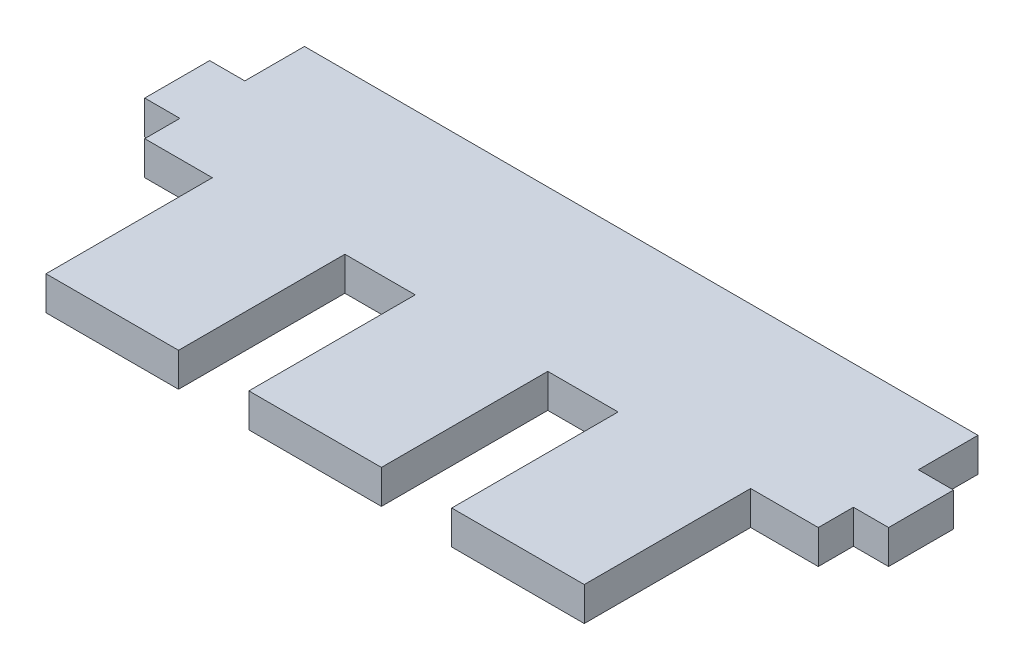
ISO-10303-21;
HEADER;
FILE_DESCRIPTION(('STEP AP214'),'2;1');
FILE_NAME('part.step','',(''),(''),'','','');
FILE_SCHEMA(('AUTOMOTIVE_DESIGN { 1 0 10303 214 1 1 1 1 }'));
ENDSEC;
DATA;
#1=APPLICATION_CONTEXT('core data for automotive mechanical design processes');
#2=APPLICATION_PROTOCOL_DEFINITION('international standard','automotive_design',2000,#1);
#3=PRODUCT_CONTEXT('',#1,'mechanical');
#4=PRODUCT('Part','Part','',(#3));
#5=PRODUCT_RELATED_PRODUCT_CATEGORY('part','',(#4));
#6=PRODUCT_DEFINITION_FORMATION('','',#4);
#7=PRODUCT_DEFINITION_CONTEXT('part definition',#1,'design');
#8=PRODUCT_DEFINITION('design','',#6,#7);
#9=PRODUCT_DEFINITION_SHAPE('','',#8);
#10=(LENGTH_UNIT() NAMED_UNIT(*) SI_UNIT(.MILLI.,.METRE.));
#11=(NAMED_UNIT(*) PLANE_ANGLE_UNIT() SI_UNIT($,.RADIAN.));
#12=(NAMED_UNIT(*) SI_UNIT($,.STERADIAN.) SOLID_ANGLE_UNIT());
#13=UNCERTAINTY_MEASURE_WITH_UNIT(LENGTH_MEASURE(1.E-05),#10,'distance_accuracy_value','');
#14=(GEOMETRIC_REPRESENTATION_CONTEXT(3) GLOBAL_UNCERTAINTY_ASSIGNED_CONTEXT((#13)) GLOBAL_UNIT_ASSIGNED_CONTEXT((#10,
#11,#12)) REPRESENTATION_CONTEXT('',''));
#15=CARTESIAN_POINT('',(0.,0.,0.));
#16=DIRECTION('',(0.,0.,1.));
#17=DIRECTION('',(1.,0.,0.));
#18=AXIS2_PLACEMENT_3D('',#15,#16,#17);
#19=CARTESIAN_POINT('',(-69.85,6.35,28.575));
#20=DIRECTION('',(0.,0.,-1.));
#21=DIRECTION('',(-1.,0.,0.));
#22=AXIS2_PLACEMENT_3D('',#19,#20,#21);
#23=PLANE('',#22);
#24=DIRECTION('',(0.,-1.,0.));
#25=VECTOR('',#24,1.);
#26=CARTESIAN_POINT('',(63.2460000000005,6.35,28.575));
#27=LINE('',#26,#25);
#28=CARTESIAN_POINT('',(63.2460000000005,6.35,28.575));
#29=VERTEX_POINT('',#28);
#30=CARTESIAN_POINT('',(63.2460000000005,0.,28.575));
#31=VERTEX_POINT('',#30);
#32=EDGE_CURVE('E247',#29,#31,#27,.T.);
#33=ORIENTED_EDGE('',*,*,#32,.F.);
#34=DIRECTION('',(1.,0.,0.));
#35=VECTOR('',#34,1.);
#36=CARTESIAN_POINT('',(-69.85,6.35,28.575));
#37=LINE('',#36,#35);
#38=CARTESIAN_POINT('',(50.546,6.35,28.575));
#39=VERTEX_POINT('',#38);
#40=EDGE_CURVE('E335',#39,#29,#37,.T.);
#41=ORIENTED_EDGE('',*,*,#40,.F.);
#42=DIRECTION('',(0.,-1.,0.));
#43=VECTOR('',#42,1.);
#44=CARTESIAN_POINT('',(50.546,6.35,28.575));
#45=LINE('',#44,#43);
#46=CARTESIAN_POINT('',(50.546,0.,28.575));
#47=VERTEX_POINT('',#46);
#48=EDGE_CURVE('E260',#39,#47,#45,.T.);
#49=ORIENTED_EDGE('',*,*,#48,.T.);
#50=DIRECTION('',(1.,0.,0.));
#51=VECTOR('',#50,1.);
#52=CARTESIAN_POINT('',(-69.85,0.,28.575));
#53=LINE('',#52,#51);
#54=EDGE_CURVE('E345',#47,#31,#53,.T.);
#55=ORIENTED_EDGE('',*,*,#54,.T.);
#56=EDGE_LOOP('',(#33,#41,#49,#55));
#57=FACE_BOUND('',#56,.T.);
#58=ADVANCED_FACE('F35',(#57),#23,.F.);
#59=DIRECTION('',(0.,1.,0.));
#60=VECTOR('',#59,1.);
#61=CARTESIAN_POINT('',(-63.2460000000005,6.35,28.575));
#62=LINE('',#61,#60);
#63=CARTESIAN_POINT('',(-63.2460000000005,0.,28.575));
#64=VERTEX_POINT('',#63);
#65=CARTESIAN_POINT('',(-63.2460000000005,6.35,28.575));
#66=VERTEX_POINT('',#65);
#67=EDGE_CURVE('E241',#64,#66,#62,.T.);
#68=ORIENTED_EDGE('',*,*,#67,.F.);
#69=CARTESIAN_POINT('',(-50.546,0.,28.575));
#70=VERTEX_POINT('',#69);
#71=EDGE_CURVE('E332',#64,#70,#53,.T.);
#72=ORIENTED_EDGE('',*,*,#71,.T.);
#73=DIRECTION('',(0.,-1.,0.));
#74=VECTOR('',#73,1.);
#75=CARTESIAN_POINT('',(-50.546,6.35,28.575));
#76=LINE('',#75,#74);
#77=CARTESIAN_POINT('',(-50.546,6.35,28.575));
#78=VERTEX_POINT('',#77);
#79=EDGE_CURVE('E324',#78,#70,#76,.T.);
#80=ORIENTED_EDGE('',*,*,#79,.F.);
#81=EDGE_CURVE('E336',#66,#78,#37,.T.);
#82=ORIENTED_EDGE('',*,*,#81,.F.);
#83=EDGE_LOOP('',(#68,#72,#80,#82));
#84=FACE_BOUND('',#83,.T.);
#85=ADVANCED_FACE('F433',(#84),#23,.F.);
#86=CARTESIAN_POINT('',(69.85,6.35,28.575));
#87=DIRECTION('',(-1.,0.,0.));
#88=DIRECTION('',(0.,0.,1.));
#89=AXIS2_PLACEMENT_3D('',#86,#87,#88);
#90=PLANE('',#89);
#91=DIRECTION('',(0.,1.,0.));
#92=VECTOR('',#91,1.);
#93=CARTESIAN_POINT('',(69.85,6.35,21.971));
#94=LINE('',#93,#92);
#95=CARTESIAN_POINT('',(69.85,0.,21.971));
#96=VERTEX_POINT('',#95);
#97=CARTESIAN_POINT('',(69.85,6.35,21.971));
#98=VERTEX_POINT('',#97);
#99=EDGE_CURVE('E249',#96,#98,#94,.T.);
#100=ORIENTED_EDGE('',*,*,#99,.F.);
#101=DIRECTION('',(0.,0.,-1.));
#102=VECTOR('',#101,1.);
#103=CARTESIAN_POINT('',(69.85,0.,28.575));
#104=LINE('',#103,#102);
#105=CARTESIAN_POINT('',(69.85,0.,9.77899999999998));
#106=VERTEX_POINT('',#105);
#107=EDGE_CURVE('E327',#96,#106,#104,.T.);
#108=ORIENTED_EDGE('',*,*,#107,.T.);
#109=DIRECTION('',(0.,-1.,0.));
#110=VECTOR('',#109,1.);
#111=CARTESIAN_POINT('',(69.85,6.35,9.77899999999998));
#112=LINE('',#111,#110);
#113=CARTESIAN_POINT('',(69.85,6.35,9.77899999999998));
#114=VERTEX_POINT('',#113);
#115=EDGE_CURVE('E243',#114,#106,#112,.T.);
#116=ORIENTED_EDGE('',*,*,#115,.F.);
#117=DIRECTION('',(0.,0.,-1.));
#118=VECTOR('',#117,1.);
#119=CARTESIAN_POINT('',(69.85,6.35,28.575));
#120=LINE('',#119,#118);
#121=EDGE_CURVE('E328',#98,#114,#120,.T.);
#122=ORIENTED_EDGE('',*,*,#121,.F.);
#123=EDGE_LOOP('',(#100,#108,#116,#122));
#124=FACE_BOUND('',#123,.T.);
#125=ADVANCED_FACE('F37',(#124),#90,.F.);
#126=CARTESIAN_POINT('',(-69.85,6.35,28.575));
#127=DIRECTION('',(1.,0.,0.));
#128=DIRECTION('',(0.,0.,-1.));
#129=AXIS2_PLACEMENT_3D('',#126,#127,#128);
#130=PLANE('',#129);
#131=DIRECTION('',(0.,1.,0.));
#132=VECTOR('',#131,1.);
#133=CARTESIAN_POINT('',(-69.85,6.35,9.77899999999998));
#134=LINE('',#133,#132);
#135=CARTESIAN_POINT('',(-69.85,0.,9.77899999999998));
#136=VERTEX_POINT('',#135);
#137=CARTESIAN_POINT('',(-69.85,6.35,9.77899999999998));
#138=VERTEX_POINT('',#137);
#139=EDGE_CURVE('E245',#136,#138,#134,.T.);
#140=ORIENTED_EDGE('',*,*,#139,.F.);
#141=DIRECTION('',(0.,0.,1.));
#142=VECTOR('',#141,1.);
#143=CARTESIAN_POINT('',(-69.85,0.,28.575));
#144=LINE('',#143,#142);
#145=CARTESIAN_POINT('',(-69.85,0.,21.971));
#146=VERTEX_POINT('',#145);
#147=EDGE_CURVE('E342',#136,#146,#144,.T.);
#148=ORIENTED_EDGE('',*,*,#147,.T.);
#149=DIRECTION('',(0.,-1.,0.));
#150=VECTOR('',#149,1.);
#151=CARTESIAN_POINT('',(-69.85,6.35,21.971));
#152=LINE('',#151,#150);
#153=CARTESIAN_POINT('',(-69.85,6.35,21.971));
#154=VERTEX_POINT('',#153);
#155=EDGE_CURVE('E239',#154,#146,#152,.T.);
#156=ORIENTED_EDGE('',*,*,#155,.F.);
#157=DIRECTION('',(0.,0.,1.));
#158=VECTOR('',#157,1.);
#159=CARTESIAN_POINT('',(-69.85,6.35,28.575));
#160=LINE('',#159,#158);
#161=EDGE_CURVE('E331',#138,#154,#160,.T.);
#162=ORIENTED_EDGE('',*,*,#161,.F.);
#163=EDGE_LOOP('',(#140,#148,#156,#162));
#164=FACE_BOUND('',#163,.T.);
#165=ADVANCED_FACE('F446',(#164),#130,.F.);
#166=CARTESIAN_POINT('',(0.,6.35,0.));
#167=DIRECTION('',(0.,-1.,0.));
#168=DIRECTION('',(0.,0.,-1.));
#169=AXIS2_PLACEMENT_3D('',#166,#167,#168);
#170=PLANE('',#169);
#171=DIRECTION('',(0.,0.,1.));
#172=VECTOR('',#171,1.);
#173=CARTESIAN_POINT('',(63.2460000000002,6.35,-3.42900000000001));
#174=LINE('',#173,#172);
#175=CARTESIAN_POINT('',(63.2460000000002,6.35,-1.425));
#176=VERTEX_POINT('',#175);
#177=CARTESIAN_POINT('',(63.2460000000002,6.35,9.77899999999998));
#178=VERTEX_POINT('',#177);
#179=EDGE_CURVE('E205',#176,#178,#174,.T.);
#180=ORIENTED_EDGE('',*,*,#179,.F.);
#181=DIRECTION('',(1.,0.,0.));
#182=VECTOR('',#181,1.);
#183=CARTESIAN_POINT('',(-69.85,6.35,-1.425));
#184=LINE('',#183,#182);
#185=CARTESIAN_POINT('',(-63.2460000000002,6.35,-1.425));
#186=VERTEX_POINT('',#185);
#187=EDGE_CURVE('E195',#186,#176,#184,.T.);
#188=ORIENTED_EDGE('',*,*,#187,.F.);
#189=DIRECTION('',(0.,0.,-1.));
#190=VECTOR('',#189,1.);
#191=CARTESIAN_POINT('',(-63.2460000000002,6.35,-3.42900000000001));
#192=LINE('',#191,#190);
#193=CARTESIAN_POINT('',(-63.2460000000002,6.35,9.77899999999998));
#194=VERTEX_POINT('',#193);
#195=EDGE_CURVE('E203',#194,#186,#192,.T.);
#196=ORIENTED_EDGE('',*,*,#195,.F.);
#197=DIRECTION('',(1.,0.,0.));
#198=VECTOR('',#197,1.);
#199=CARTESIAN_POINT('',(-63.2460000000002,6.35,9.77899999999998));
#200=LINE('',#199,#198);
#201=EDGE_CURVE('E209',#138,#194,#200,.T.);
#202=ORIENTED_EDGE('',*,*,#201,.F.);
#203=ORIENTED_EDGE('',*,*,#161,.T.);
#204=DIRECTION('',(-1.,0.,0.));
#205=VECTOR('',#204,1.);
#206=CARTESIAN_POINT('',(-63.2460000000005,6.35,21.971));
#207=LINE('',#206,#205);
#208=CARTESIAN_POINT('',(-63.2460000000005,6.35,21.971));
#209=VERTEX_POINT('',#208);
#210=EDGE_CURVE('E232',#209,#154,#207,.T.);
#211=ORIENTED_EDGE('',*,*,#210,.F.);
#212=DIRECTION('',(0.,0.,-1.));
#213=VECTOR('',#212,1.);
#214=CARTESIAN_POINT('',(-63.2460000000005,6.35,21.971));
#215=LINE('',#214,#213);
#216=EDGE_CURVE('E230',#66,#209,#215,.T.);
#217=ORIENTED_EDGE('',*,*,#216,.F.);
#218=ORIENTED_EDGE('',*,*,#81,.T.);
#219=DIRECTION('',(0.,0.,1.));
#220=VECTOR('',#219,1.);
#221=CARTESIAN_POINT('',(-50.546,6.35,28.575));
#222=LINE('',#221,#220);
#223=CARTESIAN_POINT('',(-50.546,6.35,59.817));
#224=VERTEX_POINT('',#223);
#225=EDGE_CURVE('E304',#78,#224,#222,.T.);
#226=ORIENTED_EDGE('',*,*,#225,.T.);
#227=DIRECTION('',(1.,0.,0.));
#228=VECTOR('',#227,1.);
#229=CARTESIAN_POINT('',(-50.546,6.35,59.817));
#230=LINE('',#229,#228);
#231=CARTESIAN_POINT('',(-25.654,6.35,59.817));
#232=VERTEX_POINT('',#231);
#233=EDGE_CURVE('E306',#224,#232,#230,.T.);
#234=ORIENTED_EDGE('',*,*,#233,.T.);
#235=DIRECTION('',(0.,0.,-1.));
#236=VECTOR('',#235,1.);
#237=CARTESIAN_POINT('',(-25.654,6.35,59.817));
#238=LINE('',#237,#236);
#239=CARTESIAN_POINT('',(-25.654,6.35,28.575));
#240=VERTEX_POINT('',#239);
#241=EDGE_CURVE('E309',#232,#240,#238,.T.);
#242=ORIENTED_EDGE('',*,*,#241,.T.);
#243=CARTESIAN_POINT('',(-12.446,6.35,28.575));
#244=VERTEX_POINT('',#243);
#245=EDGE_CURVE('E339',#240,#244,#37,.T.);
#246=ORIENTED_EDGE('',*,*,#245,.T.);
#247=DIRECTION('',(0.,0.,1.));
#248=VECTOR('',#247,1.);
#249=CARTESIAN_POINT('',(-12.446,6.35,28.575));
#250=LINE('',#249,#248);
#251=CARTESIAN_POINT('',(-12.446,6.35,59.817));
#252=VERTEX_POINT('',#251);
#253=EDGE_CURVE('E278',#244,#252,#250,.T.);
#254=ORIENTED_EDGE('',*,*,#253,.T.);
#255=DIRECTION('',(1.,0.,0.));
#256=VECTOR('',#255,1.);
#257=CARTESIAN_POINT('',(-12.446,6.35,59.817));
#258=LINE('',#257,#256);
#259=CARTESIAN_POINT('',(12.446,6.35,59.817));
#260=VERTEX_POINT('',#259);
#261=EDGE_CURVE('E280',#252,#260,#258,.T.);
#262=ORIENTED_EDGE('',*,*,#261,.T.);
#263=DIRECTION('',(0.,0.,-1.));
#264=VECTOR('',#263,1.);
#265=CARTESIAN_POINT('',(12.446,6.35,59.817));
#266=LINE('',#265,#264);
#267=CARTESIAN_POINT('',(12.446,6.35,28.575));
#268=VERTEX_POINT('',#267);
#269=EDGE_CURVE('E283',#260,#268,#266,.T.);
#270=ORIENTED_EDGE('',*,*,#269,.T.);
#271=CARTESIAN_POINT('',(25.654,6.35,28.575));
#272=VERTEX_POINT('',#271);
#273=EDGE_CURVE('E376',#268,#272,#37,.T.);
#274=ORIENTED_EDGE('',*,*,#273,.T.);
#275=DIRECTION('',(0.,0.,1.));
#276=VECTOR('',#275,1.);
#277=CARTESIAN_POINT('',(25.654,6.35,28.575));
#278=LINE('',#277,#276);
#279=CARTESIAN_POINT('',(25.654,6.35,59.817));
#280=VERTEX_POINT('',#279);
#281=EDGE_CURVE('E252',#272,#280,#278,.T.);
#282=ORIENTED_EDGE('',*,*,#281,.T.);
#283=DIRECTION('',(1.,0.,0.));
#284=VECTOR('',#283,1.);
#285=CARTESIAN_POINT('',(25.654,6.35,59.817));
#286=LINE('',#285,#284);
#287=CARTESIAN_POINT('',(50.5459999999999,6.35,59.817));
#288=VERTEX_POINT('',#287);
#289=EDGE_CURVE('E254',#280,#288,#286,.T.);
#290=ORIENTED_EDGE('',*,*,#289,.T.);
#291=DIRECTION('',(0.,0.,-1.));
#292=VECTOR('',#291,1.);
#293=CARTESIAN_POINT('',(50.5459999999999,6.35,59.817));
#294=LINE('',#293,#292);
#295=EDGE_CURVE('E257',#288,#39,#294,.T.);
#296=ORIENTED_EDGE('',*,*,#295,.T.);
#297=ORIENTED_EDGE('',*,*,#40,.T.);
#298=DIRECTION('',(0.,0.,1.));
#299=VECTOR('',#298,1.);
#300=CARTESIAN_POINT('',(63.2460000000005,6.35,21.971));
#301=LINE('',#300,#299);
#302=CARTESIAN_POINT('',(63.2460000000005,6.35,21.971));
#303=VERTEX_POINT('',#302);
#304=EDGE_CURVE('E221',#303,#29,#301,.T.);
#305=ORIENTED_EDGE('',*,*,#304,.F.);
#306=DIRECTION('',(-1.,0.,0.));
#307=VECTOR('',#306,1.);
#308=CARTESIAN_POINT('',(63.2460000000005,6.35,21.971));
#309=LINE('',#308,#307);
#310=EDGE_CURVE('E219',#98,#303,#309,.T.);
#311=ORIENTED_EDGE('',*,*,#310,.F.);
#312=ORIENTED_EDGE('',*,*,#121,.T.);
#313=DIRECTION('',(1.,0.,0.));
#314=VECTOR('',#313,1.);
#315=CARTESIAN_POINT('',(63.2460000000002,6.35,9.77899999999998));
#316=LINE('',#315,#314);
#317=EDGE_CURVE('E367',#178,#114,#316,.T.);
#318=ORIENTED_EDGE('',*,*,#317,.F.);
#319=EDGE_LOOP('',(#180,#188,#196,#202,#203,#211,#217,#218,#226,#234,#242,#246,#254,#262,#270,
#274,#282,#290,#296,#297,#305,#311,#312,#318));
#320=FACE_BOUND('',#319,.T.);
#321=ADVANCED_FACE('F201',(#320),#170,.F.);
#322=CARTESIAN_POINT('',(0.,0.,0.));
#323=DIRECTION('',(0.,-1.,0.));
#324=DIRECTION('',(0.,0.,-1.));
#325=AXIS2_PLACEMENT_3D('',#322,#323,#324);
#326=PLANE('',#325);
#327=DIRECTION('',(1.,0.,0.));
#328=VECTOR('',#327,1.);
#329=CARTESIAN_POINT('',(-69.85,0.,-1.425));
#330=LINE('',#329,#328);
#331=CARTESIAN_POINT('',(-63.2460000000002,0.,-1.425));
#332=VERTEX_POINT('',#331);
#333=CARTESIAN_POINT('',(63.2460000000002,0.,-1.425));
#334=VERTEX_POINT('',#333);
#335=EDGE_CURVE('E49',#332,#334,#330,.T.);
#336=ORIENTED_EDGE('',*,*,#335,.T.);
#337=DIRECTION('',(0.,0.,1.));
#338=VECTOR('',#337,1.);
#339=CARTESIAN_POINT('',(63.2460000000002,0.,-3.42900000000001));
#340=LINE('',#339,#338);
#341=CARTESIAN_POINT('',(63.2460000000002,0.,9.77899999999998));
#342=VERTEX_POINT('',#341);
#343=EDGE_CURVE('E229',#334,#342,#340,.T.);
#344=ORIENTED_EDGE('',*,*,#343,.T.);
#345=DIRECTION('',(1.,0.,0.));
#346=VECTOR('',#345,1.);
#347=CARTESIAN_POINT('',(63.2460000000002,0.,9.77899999999998));
#348=LINE('',#347,#346);
#349=EDGE_CURVE('E517',#342,#106,#348,.T.);
#350=ORIENTED_EDGE('',*,*,#349,.T.);
#351=ORIENTED_EDGE('',*,*,#107,.F.);
#352=DIRECTION('',(-1.,0.,0.));
#353=VECTOR('',#352,1.);
#354=CARTESIAN_POINT('',(0.,0.,21.971));
#355=LINE('',#354,#353);
#356=CARTESIAN_POINT('',(63.2460000000005,0.,21.971));
#357=VERTEX_POINT('',#356);
#358=EDGE_CURVE('E43',#96,#357,#355,.T.);
#359=ORIENTED_EDGE('',*,*,#358,.T.);
#360=DIRECTION('',(0.,0.,1.));
#361=VECTOR('',#360,1.);
#362=CARTESIAN_POINT('',(63.2460000000005,0.,21.971));
#363=LINE('',#362,#361);
#364=EDGE_CURVE('E222',#357,#31,#363,.T.);
#365=ORIENTED_EDGE('',*,*,#364,.T.);
#366=ORIENTED_EDGE('',*,*,#54,.F.);
#367=DIRECTION('',(0.,0.,-1.));
#368=VECTOR('',#367,1.);
#369=CARTESIAN_POINT('',(50.5459999999999,0.,59.817));
#370=LINE('',#369,#368);
#371=CARTESIAN_POINT('',(50.5459999999999,0.,59.817));
#372=VERTEX_POINT('',#371);
#373=EDGE_CURVE('E255',#372,#47,#370,.T.);
#374=ORIENTED_EDGE('',*,*,#373,.F.);
#375=DIRECTION('',(1.,0.,0.));
#376=VECTOR('',#375,1.);
#377=CARTESIAN_POINT('',(25.654,0.,59.817));
#378=LINE('',#377,#376);
#379=CARTESIAN_POINT('',(25.654,0.,59.817));
#380=VERTEX_POINT('',#379);
#381=EDGE_CURVE('E262',#380,#372,#378,.T.);
#382=ORIENTED_EDGE('',*,*,#381,.F.);
#383=DIRECTION('',(0.,0.,1.));
#384=VECTOR('',#383,1.);
#385=CARTESIAN_POINT('',(25.654,0.,28.575));
#386=LINE('',#385,#384);
#387=CARTESIAN_POINT('',(25.654,0.,28.575));
#388=VERTEX_POINT('',#387);
#389=EDGE_CURVE('E251',#388,#380,#386,.T.);
#390=ORIENTED_EDGE('',*,*,#389,.F.);
#391=CARTESIAN_POINT('',(12.446,0.,28.575));
#392=VERTEX_POINT('',#391);
#393=EDGE_CURVE('E401',#392,#388,#53,.T.);
#394=ORIENTED_EDGE('',*,*,#393,.F.);
#395=DIRECTION('',(0.,0.,-1.));
#396=VECTOR('',#395,1.);
#397=CARTESIAN_POINT('',(12.446,0.,59.817));
#398=LINE('',#397,#396);
#399=CARTESIAN_POINT('',(12.446,0.,59.817));
#400=VERTEX_POINT('',#399);
#401=EDGE_CURVE('E281',#400,#392,#398,.T.);
#402=ORIENTED_EDGE('',*,*,#401,.F.);
#403=DIRECTION('',(1.,0.,0.));
#404=VECTOR('',#403,1.);
#405=CARTESIAN_POINT('',(-12.446,0.,59.817));
#406=LINE('',#405,#404);
#407=CARTESIAN_POINT('',(-12.446,0.,59.817));
#408=VERTEX_POINT('',#407);
#409=EDGE_CURVE('E288',#408,#400,#406,.T.);
#410=ORIENTED_EDGE('',*,*,#409,.F.);
#411=DIRECTION('',(0.,0.,1.));
#412=VECTOR('',#411,1.);
#413=CARTESIAN_POINT('',(-12.446,0.,28.575));
#414=LINE('',#413,#412);
#415=CARTESIAN_POINT('',(-12.446,0.,28.575));
#416=VERTEX_POINT('',#415);
#417=EDGE_CURVE('E277',#416,#408,#414,.T.);
#418=ORIENTED_EDGE('',*,*,#417,.F.);
#419=CARTESIAN_POINT('',(-25.654,0.,28.575));
#420=VERTEX_POINT('',#419);
#421=EDGE_CURVE('E347',#420,#416,#53,.T.);
#422=ORIENTED_EDGE('',*,*,#421,.F.);
#423=DIRECTION('',(0.,0.,-1.));
#424=VECTOR('',#423,1.);
#425=CARTESIAN_POINT('',(-25.654,0.,59.817));
#426=LINE('',#425,#424);
#427=CARTESIAN_POINT('',(-25.654,0.,59.817));
#428=VERTEX_POINT('',#427);
#429=EDGE_CURVE('E307',#428,#420,#426,.T.);
#430=ORIENTED_EDGE('',*,*,#429,.F.);
#431=DIRECTION('',(1.,0.,0.));
#432=VECTOR('',#431,1.);
#433=CARTESIAN_POINT('',(-50.546,0.,59.817));
#434=LINE('',#433,#432);
#435=CARTESIAN_POINT('',(-50.546,0.,59.817));
#436=VERTEX_POINT('',#435);
#437=EDGE_CURVE('E313',#436,#428,#434,.T.);
#438=ORIENTED_EDGE('',*,*,#437,.F.);
#439=DIRECTION('',(0.,0.,1.));
#440=VECTOR('',#439,1.);
#441=CARTESIAN_POINT('',(-50.546,0.,28.575));
#442=LINE('',#441,#440);
#443=EDGE_CURVE('E303',#70,#436,#442,.T.);
#444=ORIENTED_EDGE('',*,*,#443,.F.);
#445=ORIENTED_EDGE('',*,*,#71,.F.);
#446=DIRECTION('',(0.,0.,-1.));
#447=VECTOR('',#446,1.);
#448=CARTESIAN_POINT('',(-63.2460000000005,0.,1.32906506313301E-13));
#449=LINE('',#448,#447);
#450=CARTESIAN_POINT('',(-63.2460000000005,0.,21.971));
#451=VERTEX_POINT('',#450);
#452=EDGE_CURVE('E338',#64,#451,#449,.T.);
#453=ORIENTED_EDGE('',*,*,#452,.T.);
#454=DIRECTION('',(-1.,0.,0.));
#455=VECTOR('',#454,1.);
#456=CARTESIAN_POINT('',(-63.2460000000005,0.,21.971));
#457=LINE('',#456,#455);
#458=EDGE_CURVE('E218',#451,#146,#457,.T.);
#459=ORIENTED_EDGE('',*,*,#458,.T.);
#460=ORIENTED_EDGE('',*,*,#147,.F.);
#461=DIRECTION('',(1.,0.,0.));
#462=VECTOR('',#461,1.);
#463=CARTESIAN_POINT('',(0.,0.,9.77899999999994));
#464=LINE('',#463,#462);
#465=CARTESIAN_POINT('',(-63.2460000000002,0.,9.77899999999998));
#466=VERTEX_POINT('',#465);
#467=EDGE_CURVE('E350',#136,#466,#464,.T.);
#468=ORIENTED_EDGE('',*,*,#467,.T.);
#469=DIRECTION('',(0.,0.,-1.));
#470=VECTOR('',#469,1.);
#471=CARTESIAN_POINT('',(-63.2460000000002,0.,-3.42900000000001));
#472=LINE('',#471,#470);
#473=EDGE_CURVE('E56',#466,#332,#472,.T.);
#474=ORIENTED_EDGE('',*,*,#473,.T.);
#475=EDGE_LOOP('',(#336,#344,#350,#351,#359,#365,#366,#374,#382,#390,#394,#402,#410,#418,#422,
#430,#438,#444,#445,#453,#459,#460,#468,#474));
#476=FACE_BOUND('',#475,.T.);
#477=ADVANCED_FACE('F355',(#476),#326,.T.);
#478=DIRECTION('',(0.,-1.,0.));
#479=VECTOR('',#478,1.);
#480=CARTESIAN_POINT('',(25.654,6.35,28.575));
#481=LINE('',#480,#479);
#482=EDGE_CURVE('E274',#272,#388,#481,.T.);
#483=ORIENTED_EDGE('',*,*,#482,.F.);
#484=ORIENTED_EDGE('',*,*,#273,.F.);
#485=DIRECTION('',(0.,-1.,0.));
#486=VECTOR('',#485,1.);
#487=CARTESIAN_POINT('',(12.446,6.35,28.575));
#488=LINE('',#487,#486);
#489=EDGE_CURVE('E286',#268,#392,#488,.T.);
#490=ORIENTED_EDGE('',*,*,#489,.T.);
#491=ORIENTED_EDGE('',*,*,#393,.T.);
#492=EDGE_LOOP('',(#483,#484,#490,#491));
#493=FACE_BOUND('',#492,.T.);
#494=ADVANCED_FACE('F400',(#493),#23,.F.);
#495=DIRECTION('',(0.,-1.,0.));
#496=VECTOR('',#495,1.);
#497=CARTESIAN_POINT('',(-12.446,6.35,28.575));
#498=LINE('',#497,#496);
#499=EDGE_CURVE('E300',#244,#416,#498,.T.);
#500=ORIENTED_EDGE('',*,*,#499,.F.);
#501=ORIENTED_EDGE('',*,*,#245,.F.);
#502=DIRECTION('',(0.,-1.,0.));
#503=VECTOR('',#502,1.);
#504=CARTESIAN_POINT('',(-25.654,6.35,28.575));
#505=LINE('',#504,#503);
#506=EDGE_CURVE('E311',#240,#420,#505,.T.);
#507=ORIENTED_EDGE('',*,*,#506,.T.);
#508=ORIENTED_EDGE('',*,*,#421,.T.);
#509=EDGE_LOOP('',(#500,#501,#507,#508));
#510=FACE_BOUND('',#509,.T.);
#511=ADVANCED_FACE('F415',(#510),#23,.F.);
#512=CARTESIAN_POINT('',(-50.546,6.35,28.575));
#513=DIRECTION('',(1.,0.,0.));
#514=DIRECTION('',(0.,0.,-1.));
#515=AXIS2_PLACEMENT_3D('',#512,#513,#514);
#516=PLANE('',#515);
#517=ORIENTED_EDGE('',*,*,#443,.T.);
#518=DIRECTION('',(0.,-1.,0.));
#519=VECTOR('',#518,1.);
#520=CARTESIAN_POINT('',(-50.546,6.35,59.817));
#521=LINE('',#520,#519);
#522=EDGE_CURVE('E321',#224,#436,#521,.T.);
#523=ORIENTED_EDGE('',*,*,#522,.F.);
#524=ORIENTED_EDGE('',*,*,#225,.F.);
#525=ORIENTED_EDGE('',*,*,#79,.T.);
#526=EDGE_LOOP('',(#517,#523,#524,#525));
#527=FACE_BOUND('',#526,.T.);
#528=ADVANCED_FACE('F428',(#527),#516,.F.);
#529=CARTESIAN_POINT('',(-50.546,6.35,59.817));
#530=DIRECTION('',(0.,0.,-1.));
#531=DIRECTION('',(-1.,0.,0.));
#532=AXIS2_PLACEMENT_3D('',#529,#530,#531);
#533=PLANE('',#532);
#534=ORIENTED_EDGE('',*,*,#437,.T.);
#535=DIRECTION('',(0.,-1.,0.));
#536=VECTOR('',#535,1.);
#537=CARTESIAN_POINT('',(-25.654,6.35,59.817));
#538=LINE('',#537,#536);
#539=EDGE_CURVE('E318',#232,#428,#538,.T.);
#540=ORIENTED_EDGE('',*,*,#539,.F.);
#541=ORIENTED_EDGE('',*,*,#233,.F.);
#542=ORIENTED_EDGE('',*,*,#522,.T.);
#543=EDGE_LOOP('',(#534,#540,#541,#542));
#544=FACE_BOUND('',#543,.T.);
#545=ADVANCED_FACE('F424',(#544),#533,.F.);
#546=CARTESIAN_POINT('',(-25.654,6.35,59.817));
#547=DIRECTION('',(-1.,0.,0.));
#548=DIRECTION('',(0.,0.,1.));
#549=AXIS2_PLACEMENT_3D('',#546,#547,#548);
#550=PLANE('',#549);
#551=ORIENTED_EDGE('',*,*,#429,.T.);
#552=ORIENTED_EDGE('',*,*,#506,.F.);
#553=ORIENTED_EDGE('',*,*,#241,.F.);
#554=ORIENTED_EDGE('',*,*,#539,.T.);
#555=EDGE_LOOP('',(#551,#552,#553,#554));
#556=FACE_BOUND('',#555,.T.);
#557=ADVANCED_FACE('F420',(#556),#550,.F.);
#558=CARTESIAN_POINT('',(-12.446,6.35,28.575));
#559=DIRECTION('',(1.,0.,0.));
#560=DIRECTION('',(0.,0.,-1.));
#561=AXIS2_PLACEMENT_3D('',#558,#559,#560);
#562=PLANE('',#561);
#563=ORIENTED_EDGE('',*,*,#417,.T.);
#564=DIRECTION('',(0.,-1.,0.));
#565=VECTOR('',#564,1.);
#566=CARTESIAN_POINT('',(-12.446,6.35,59.817));
#567=LINE('',#566,#565);
#568=EDGE_CURVE('E297',#252,#408,#567,.T.);
#569=ORIENTED_EDGE('',*,*,#568,.F.);
#570=ORIENTED_EDGE('',*,*,#253,.F.);
#571=ORIENTED_EDGE('',*,*,#499,.T.);
#572=EDGE_LOOP('',(#563,#569,#570,#571));
#573=FACE_BOUND('',#572,.T.);
#574=ADVANCED_FACE('F387',(#573),#562,.F.);
#575=CARTESIAN_POINT('',(-12.446,6.35,59.817));
#576=DIRECTION('',(0.,0.,-1.));
#577=DIRECTION('',(-1.,0.,0.));
#578=AXIS2_PLACEMENT_3D('',#575,#576,#577);
#579=PLANE('',#578);
#580=ORIENTED_EDGE('',*,*,#409,.T.);
#581=DIRECTION('',(0.,-1.,0.));
#582=VECTOR('',#581,1.);
#583=CARTESIAN_POINT('',(12.446,6.35,59.817));
#584=LINE('',#583,#582);
#585=EDGE_CURVE('E294',#260,#400,#584,.T.);
#586=ORIENTED_EDGE('',*,*,#585,.F.);
#587=ORIENTED_EDGE('',*,*,#261,.F.);
#588=ORIENTED_EDGE('',*,*,#568,.T.);
#589=EDGE_LOOP('',(#580,#586,#587,#588));
#590=FACE_BOUND('',#589,.T.);
#591=ADVANCED_FACE('F393',(#590),#579,.F.);
#592=CARTESIAN_POINT('',(12.446,6.35,59.817));
#593=DIRECTION('',(-1.,0.,0.));
#594=DIRECTION('',(0.,0.,1.));
#595=AXIS2_PLACEMENT_3D('',#592,#593,#594);
#596=PLANE('',#595);
#597=ORIENTED_EDGE('',*,*,#401,.T.);
#598=ORIENTED_EDGE('',*,*,#489,.F.);
#599=ORIENTED_EDGE('',*,*,#269,.F.);
#600=ORIENTED_EDGE('',*,*,#585,.T.);
#601=EDGE_LOOP('',(#597,#598,#599,#600));
#602=FACE_BOUND('',#601,.T.);
#603=ADVANCED_FACE('F397',(#602),#596,.F.);
#604=CARTESIAN_POINT('',(25.654,6.35,28.575));
#605=DIRECTION('',(1.,0.,0.));
#606=DIRECTION('',(0.,0.,-1.));
#607=AXIS2_PLACEMENT_3D('',#604,#605,#606);
#608=PLANE('',#607);
#609=ORIENTED_EDGE('',*,*,#389,.T.);
#610=DIRECTION('',(0.,-1.,0.));
#611=VECTOR('',#610,1.);
#612=CARTESIAN_POINT('',(25.654,6.35,59.817));
#613=LINE('',#612,#611);
#614=EDGE_CURVE('E271',#280,#380,#613,.T.);
#615=ORIENTED_EDGE('',*,*,#614,.F.);
#616=ORIENTED_EDGE('',*,*,#281,.F.);
#617=ORIENTED_EDGE('',*,*,#482,.T.);
#618=EDGE_LOOP('',(#609,#615,#616,#617));
#619=FACE_BOUND('',#618,.T.);
#620=ADVANCED_FACE('F404',(#619),#608,.F.);
#621=CARTESIAN_POINT('',(25.654,6.35,59.817));
#622=DIRECTION('',(0.,0.,-1.));
#623=DIRECTION('',(-1.,0.,0.));
#624=AXIS2_PLACEMENT_3D('',#621,#622,#623);
#625=PLANE('',#624);
#626=ORIENTED_EDGE('',*,*,#381,.T.);
#627=DIRECTION('',(0.,-1.,0.));
#628=VECTOR('',#627,1.);
#629=CARTESIAN_POINT('',(50.5459999999999,6.35,59.817));
#630=LINE('',#629,#628);
#631=EDGE_CURVE('E268',#288,#372,#630,.T.);
#632=ORIENTED_EDGE('',*,*,#631,.F.);
#633=ORIENTED_EDGE('',*,*,#289,.F.);
#634=ORIENTED_EDGE('',*,*,#614,.T.);
#635=EDGE_LOOP('',(#626,#632,#633,#634));
#636=FACE_BOUND('',#635,.T.);
#637=ADVANCED_FACE('F409',(#636),#625,.F.);
#638=CARTESIAN_POINT('',(50.5459999999999,6.35,59.817));
#639=DIRECTION('',(-1.,0.,0.));
#640=DIRECTION('',(0.,0.,1.));
#641=AXIS2_PLACEMENT_3D('',#638,#639,#640);
#642=PLANE('',#641);
#643=ORIENTED_EDGE('',*,*,#373,.T.);
#644=ORIENTED_EDGE('',*,*,#48,.F.);
#645=ORIENTED_EDGE('',*,*,#295,.F.);
#646=ORIENTED_EDGE('',*,*,#631,.T.);
#647=EDGE_LOOP('',(#643,#644,#645,#646));
#648=FACE_BOUND('',#647,.T.);
#649=ADVANCED_FACE('F413',(#648),#642,.F.);
#650=CARTESIAN_POINT('',(-63.2460000000005,6.35,21.971));
#651=DIRECTION('',(-1.,0.,0.));
#652=DIRECTION('',(0.,0.,1.));
#653=AXIS2_PLACEMENT_3D('',#650,#651,#652);
#654=PLANE('',#653);
#655=ORIENTED_EDGE('',*,*,#67,.T.);
#656=ORIENTED_EDGE('',*,*,#216,.T.);
#657=DIRECTION('',(0.,-1.,0.));
#658=VECTOR('',#657,1.);
#659=CARTESIAN_POINT('',(-63.2460000000005,6.35,21.971));
#660=LINE('',#659,#658);
#661=EDGE_CURVE('E234',#209,#451,#660,.T.);
#662=ORIENTED_EDGE('',*,*,#661,.T.);
#663=ORIENTED_EDGE('',*,*,#452,.F.);
#664=EDGE_LOOP('',(#655,#656,#662,#663));
#665=FACE_BOUND('',#664,.T.);
#666=ADVANCED_FACE('F437',(#665),#654,.T.);
#667=CARTESIAN_POINT('',(-63.2460000000005,6.35,21.971));
#668=DIRECTION('',(0.,0.,1.));
#669=DIRECTION('',(1.,0.,0.));
#670=AXIS2_PLACEMENT_3D('',#667,#668,#669);
#671=PLANE('',#670);
#672=ORIENTED_EDGE('',*,*,#155,.T.);
#673=ORIENTED_EDGE('',*,*,#458,.F.);
#674=ORIENTED_EDGE('',*,*,#661,.F.);
#675=ORIENTED_EDGE('',*,*,#210,.T.);
#676=EDGE_LOOP('',(#672,#673,#674,#675));
#677=FACE_BOUND('',#676,.T.);
#678=ADVANCED_FACE('F443',(#677),#671,.T.);
#679=CARTESIAN_POINT('',(63.2460000000002,6.35,9.77899999999998));
#680=DIRECTION('',(0.,0.,-1.));
#681=DIRECTION('',(-1.,0.,0.));
#682=AXIS2_PLACEMENT_3D('',#679,#680,#681);
#683=PLANE('',#682);
#684=ORIENTED_EDGE('',*,*,#115,.T.);
#685=ORIENTED_EDGE('',*,*,#349,.F.);
#686=DIRECTION('',(0.,-1.,0.));
#687=VECTOR('',#686,1.);
#688=CARTESIAN_POINT('',(63.2460000000002,6.35,9.77899999999998));
#689=LINE('',#688,#687);
#690=EDGE_CURVE('E212',#178,#342,#689,.T.);
#691=ORIENTED_EDGE('',*,*,#690,.F.);
#692=ORIENTED_EDGE('',*,*,#317,.T.);
#693=EDGE_LOOP('',(#684,#685,#691,#692));
#694=FACE_BOUND('',#693,.T.);
#695=ADVANCED_FACE('F458',(#694),#683,.T.);
#696=CARTESIAN_POINT('',(63.2460000000002,6.35,-3.42900000000001));
#697=DIRECTION('',(1.,0.,0.));
#698=DIRECTION('',(0.,0.,-1.));
#699=AXIS2_PLACEMENT_3D('',#696,#697,#698);
#700=PLANE('',#699);
#701=DIRECTION('',(0.,-1.,0.));
#702=VECTOR('',#701,1.);
#703=CARTESIAN_POINT('',(63.2460000000002,6.35,-1.425));
#704=LINE('',#703,#702);
#705=EDGE_CURVE('E227',#176,#334,#704,.T.);
#706=ORIENTED_EDGE('',*,*,#705,.F.);
#707=ORIENTED_EDGE('',*,*,#179,.T.);
#708=ORIENTED_EDGE('',*,*,#690,.T.);
#709=ORIENTED_EDGE('',*,*,#343,.F.);
#710=EDGE_LOOP('',(#706,#707,#708,#709));
#711=FACE_BOUND('',#710,.T.);
#712=ADVANCED_FACE('F451',(#711),#700,.T.);
#713=CARTESIAN_POINT('',(-63.2460000000002,6.35,9.77899999999998));
#714=DIRECTION('',(0.,0.,-1.));
#715=DIRECTION('',(-1.,0.,0.));
#716=AXIS2_PLACEMENT_3D('',#713,#714,#715);
#717=PLANE('',#716);
#718=ORIENTED_EDGE('',*,*,#139,.T.);
#719=ORIENTED_EDGE('',*,*,#201,.T.);
#720=DIRECTION('',(0.,-1.,0.));
#721=VECTOR('',#720,1.);
#722=CARTESIAN_POINT('',(-63.2460000000002,6.35,9.77899999999998));
#723=LINE('',#722,#721);
#724=EDGE_CURVE('E208',#194,#466,#723,.T.);
#725=ORIENTED_EDGE('',*,*,#724,.T.);
#726=ORIENTED_EDGE('',*,*,#467,.F.);
#727=EDGE_LOOP('',(#718,#719,#725,#726));
#728=FACE_BOUND('',#727,.T.);
#729=ADVANCED_FACE('F449',(#728),#717,.T.);
#730=CARTESIAN_POINT('',(-63.2460000000002,6.35,-3.42900000000001));
#731=DIRECTION('',(-1.,0.,0.));
#732=DIRECTION('',(0.,0.,1.));
#733=AXIS2_PLACEMENT_3D('',#730,#731,#732);
#734=PLANE('',#733);
#735=DIRECTION('',(0.,1.,0.));
#736=VECTOR('',#735,1.);
#737=CARTESIAN_POINT('',(-63.2460000000002,6.35,-1.425));
#738=LINE('',#737,#736);
#739=EDGE_CURVE('E11',#332,#186,#738,.T.);
#740=ORIENTED_EDGE('',*,*,#739,.F.);
#741=ORIENTED_EDGE('',*,*,#473,.F.);
#742=ORIENTED_EDGE('',*,*,#724,.F.);
#743=ORIENTED_EDGE('',*,*,#195,.T.);
#744=EDGE_LOOP('',(#740,#741,#742,#743));
#745=FACE_BOUND('',#744,.T.);
#746=ADVANCED_FACE('F207',(#745),#734,.T.);
#747=CARTESIAN_POINT('',(63.2460000000005,6.35,21.971));
#748=DIRECTION('',(0.,0.,1.));
#749=DIRECTION('',(1.,0.,0.));
#750=AXIS2_PLACEMENT_3D('',#747,#748,#749);
#751=PLANE('',#750);
#752=ORIENTED_EDGE('',*,*,#99,.T.);
#753=ORIENTED_EDGE('',*,*,#310,.T.);
#754=DIRECTION('',(0.,-1.,0.));
#755=VECTOR('',#754,1.);
#756=CARTESIAN_POINT('',(63.2460000000005,6.35,21.971));
#757=LINE('',#756,#755);
#758=EDGE_CURVE('E224',#303,#357,#757,.T.);
#759=ORIENTED_EDGE('',*,*,#758,.T.);
#760=ORIENTED_EDGE('',*,*,#358,.F.);
#761=EDGE_LOOP('',(#752,#753,#759,#760));
#762=FACE_BOUND('',#761,.T.);
#763=ADVANCED_FACE('F361',(#762),#751,.T.);
#764=CARTESIAN_POINT('',(63.2460000000005,6.35,21.971));
#765=DIRECTION('',(1.,0.,0.));
#766=DIRECTION('',(0.,0.,-1.));
#767=AXIS2_PLACEMENT_3D('',#764,#765,#766);
#768=PLANE('',#767);
#769=ORIENTED_EDGE('',*,*,#32,.T.);
#770=ORIENTED_EDGE('',*,*,#364,.F.);
#771=ORIENTED_EDGE('',*,*,#758,.F.);
#772=ORIENTED_EDGE('',*,*,#304,.T.);
#773=EDGE_LOOP('',(#769,#770,#771,#772));
#774=FACE_BOUND('',#773,.T.);
#775=ADVANCED_FACE('F371',(#774),#768,.T.);
#776=CARTESIAN_POINT('',(-69.85,0.,-1.425));
#777=DIRECTION('',(0.,0.,1.));
#778=DIRECTION('',(1.,0.,0.));
#779=AXIS2_PLACEMENT_3D('',#776,#777,#778);
#780=PLANE('',#779);
#781=ORIENTED_EDGE('',*,*,#705,.T.);
#782=ORIENTED_EDGE('',*,*,#335,.F.);
#783=ORIENTED_EDGE('',*,*,#739,.T.);
#784=ORIENTED_EDGE('',*,*,#187,.T.);
#785=EDGE_LOOP('',(#781,#782,#783,#784));
#786=FACE_BOUND('',#785,.T.);
#787=ADVANCED_FACE('F194',(#786),#780,.F.);
#788=CLOSED_SHELL('',(#58,#85,#125,#165,#321,#477,#494,#511,#528,#545,#557,#574,#591,#603,#620,
#637,#649,#666,#678,#695,#712,#729,#746,#763,#775,#787));
#789=MANIFOLD_SOLID_BREP('B2',#788);
#790=ADVANCED_BREP_SHAPE_REPRESENTATION('',(#18,#789),#14);
#791=SHAPE_DEFINITION_REPRESENTATION(#9,#790);
ENDSEC;
END-ISO-10303-21;
